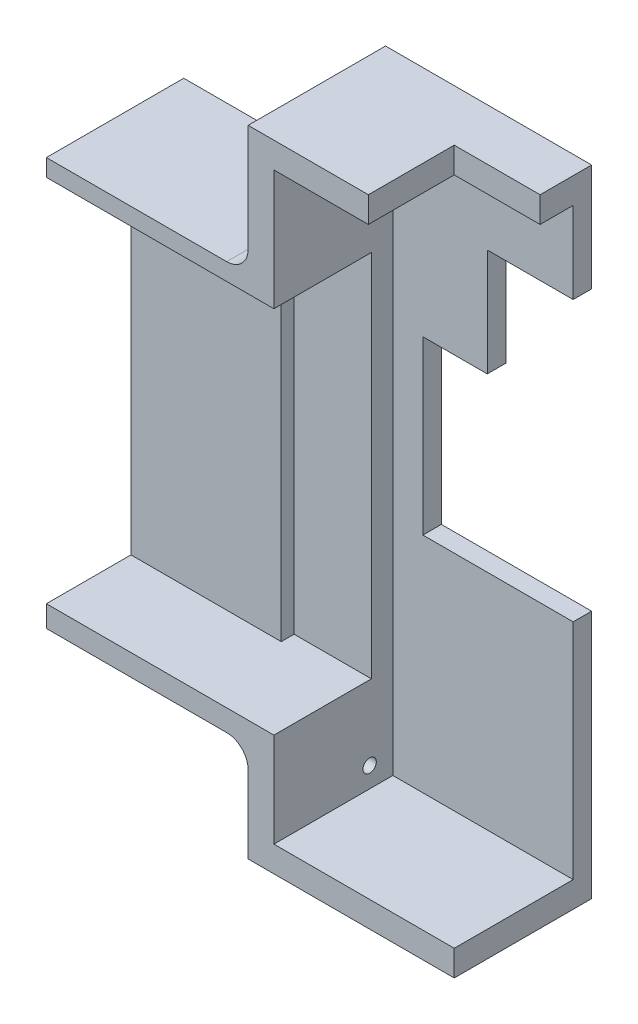
ISO-10303-21;
HEADER;
FILE_DESCRIPTION(('STEP AP214'),'2;1');
FILE_NAME('part.step','',(''),(''),'','','');
FILE_SCHEMA(('AUTOMOTIVE_DESIGN { 1 0 10303 214 1 1 1 1 }'));
ENDSEC;
DATA;
#1=APPLICATION_CONTEXT('core data for automotive mechanical design processes');
#2=APPLICATION_PROTOCOL_DEFINITION('international standard','automotive_design',2000,#1);
#3=PRODUCT_CONTEXT('',#1,'mechanical');
#4=PRODUCT('Part','Part','',(#3));
#5=PRODUCT_RELATED_PRODUCT_CATEGORY('part','',(#4));
#6=PRODUCT_DEFINITION_FORMATION('','',#4);
#7=PRODUCT_DEFINITION_CONTEXT('part definition',#1,'design');
#8=PRODUCT_DEFINITION('design','',#6,#7);
#9=PRODUCT_DEFINITION_SHAPE('','',#8);
#10=(LENGTH_UNIT() NAMED_UNIT(*) SI_UNIT(.MILLI.,.METRE.));
#11=(NAMED_UNIT(*) PLANE_ANGLE_UNIT() SI_UNIT($,.RADIAN.));
#12=(NAMED_UNIT(*) SI_UNIT($,.STERADIAN.) SOLID_ANGLE_UNIT());
#13=UNCERTAINTY_MEASURE_WITH_UNIT(LENGTH_MEASURE(1.E-05),#10,'distance_accuracy_value','');
#14=(GEOMETRIC_REPRESENTATION_CONTEXT(3) GLOBAL_UNCERTAINTY_ASSIGNED_CONTEXT((#13)) GLOBAL_UNIT_ASSIGNED_CONTEXT((#10,
#11,#12)) REPRESENTATION_CONTEXT('',''));
#15=CARTESIAN_POINT('',(0.,0.,0.));
#16=DIRECTION('',(0.,0.,1.));
#17=DIRECTION('',(1.,0.,0.));
#18=AXIS2_PLACEMENT_3D('',#15,#16,#17);
#19=CARTESIAN_POINT('',(0.,0.,0.));
#20=DIRECTION('',(0.,-1.,0.));
#21=DIRECTION('',(0.,0.,-1.));
#22=AXIS2_PLACEMENT_3D('',#19,#20,#21);
#23=PLANE('',#22);
#24=DIRECTION('',(-1.,0.,0.));
#25=VECTOR('',#24,1.);
#26=CARTESIAN_POINT('',(-65.,0.,-32.));
#27=LINE('',#26,#25);
#28=CARTESIAN_POINT('',(7.00000000000002,0.,-32.));
#29=VERTEX_POINT('',#28);
#30=CARTESIAN_POINT('',(-35.,0.,-32.));
#31=VERTEX_POINT('',#30);
#32=EDGE_CURVE('E412',#29,#31,#27,.T.);
#33=ORIENTED_EDGE('',*,*,#32,.F.);
#34=DIRECTION('',(0.,0.,1.));
#35=VECTOR('',#34,1.);
#36=CARTESIAN_POINT('',(7.00000000000002,0.,0.));
#37=LINE('',#36,#35);
#38=CARTESIAN_POINT('',(7.00000000000002,0.,0.));
#39=VERTEX_POINT('',#38);
#40=EDGE_CURVE('E448',#29,#39,#37,.T.);
#41=ORIENTED_EDGE('',*,*,#40,.T.);
#42=DIRECTION('',(-1.,0.,0.));
#43=VECTOR('',#42,1.);
#44=CARTESIAN_POINT('',(60.,0.,0.));
#45=LINE('',#44,#43);
#46=CARTESIAN_POINT('',(-35.,0.,0.));
#47=VERTEX_POINT('',#46);
#48=EDGE_CURVE('E310',#39,#47,#45,.T.);
#49=ORIENTED_EDGE('',*,*,#48,.T.);
#50=DIRECTION('',(0.,0.,1.));
#51=VECTOR('',#50,1.);
#52=CARTESIAN_POINT('',(-35.,0.,-32.));
#53=LINE('',#52,#51);
#54=EDGE_CURVE('E301',#31,#47,#53,.T.);
#55=ORIENTED_EDGE('',*,*,#54,.F.);
#56=EDGE_LOOP('',(#33,#41,#49,#55));
#57=FACE_BOUND('',#56,.T.);
#58=ADVANCED_FACE('F41',(#57),#23,.T.);
#59=CARTESIAN_POINT('',(60.,125.,-32.));
#60=DIRECTION('',(-1.,0.,0.));
#61=DIRECTION('',(0.,-1.,0.));
#62=AXIS2_PLACEMENT_3D('',#59,#60,#61);
#63=PLANE('',#62);
#64=DIRECTION('',(0.,1.,0.));
#65=VECTOR('',#64,1.);
#66=CARTESIAN_POINT('',(60.,119.,-20.));
#67=LINE('',#66,#65);
#68=CARTESIAN_POINT('',(60.,119.,-20.));
#69=VERTEX_POINT('',#68);
#70=CARTESIAN_POINT('',(60.,125.,-20.));
#71=VERTEX_POINT('',#70);
#72=EDGE_CURVE('E271',#69,#71,#67,.T.);
#73=ORIENTED_EDGE('',*,*,#72,.F.);
#74=DIRECTION('',(0.,0.,1.));
#75=VECTOR('',#74,1.);
#76=CARTESIAN_POINT('',(60.,119.,27.7));
#77=LINE('',#76,#75);
#78=CARTESIAN_POINT('',(60.,119.,-27.7));
#79=VERTEX_POINT('',#78);
#80=EDGE_CURVE('E350',#79,#69,#77,.T.);
#81=ORIENTED_EDGE('',*,*,#80,.F.);
#82=DIRECTION('',(0.,1.,0.));
#83=VECTOR('',#82,1.);
#84=CARTESIAN_POINT('',(60.,5.,-27.7));
#85=LINE('',#84,#83);
#86=CARTESIAN_POINT('',(60.,100.,-27.7));
#87=VERTEX_POINT('',#86);
#88=EDGE_CURVE('E347',#87,#79,#85,.T.);
#89=ORIENTED_EDGE('',*,*,#88,.F.);
#90=DIRECTION('',(0.,0.,1.));
#91=VECTOR('',#90,1.);
#92=CARTESIAN_POINT('',(60.,100.,-27.7));
#93=LINE('',#92,#91);
#94=CARTESIAN_POINT('',(60.,100.,-32.));
#95=VERTEX_POINT('',#94);
#96=EDGE_CURVE('E431',#95,#87,#93,.T.);
#97=ORIENTED_EDGE('',*,*,#96,.F.);
#98=DIRECTION('',(0.,-1.,0.));
#99=VECTOR('',#98,1.);
#100=CARTESIAN_POINT('',(60.,125.,-32.));
#101=LINE('',#100,#99);
#102=CARTESIAN_POINT('',(60.,125.,-32.));
#103=VERTEX_POINT('',#102);
#104=EDGE_CURVE('E341',#103,#95,#101,.T.);
#105=ORIENTED_EDGE('',*,*,#104,.F.);
#106=DIRECTION('',(0.,0.,1.));
#107=VECTOR('',#106,1.);
#108=CARTESIAN_POINT('',(60.,125.,-32.));
#109=LINE('',#108,#107);
#110=EDGE_CURVE('E344',#103,#71,#109,.T.);
#111=ORIENTED_EDGE('',*,*,#110,.T.);
#112=EDGE_LOOP('',(#73,#81,#89,#97,#105,#111));
#113=FACE_BOUND('',#112,.T.);
#114=ADVANCED_FACE('F528',(#113),#63,.F.);
#115=CARTESIAN_POINT('',(0.,125.,0.));
#116=DIRECTION('',(0.,-1.,0.));
#117=DIRECTION('',(0.,0.,-1.));
#118=AXIS2_PLACEMENT_3D('',#115,#116,#117);
#119=PLANE('',#118);
#120=DIRECTION('',(-1.,0.,0.));
#121=VECTOR('',#120,1.);
#122=CARTESIAN_POINT('',(50.,125.,-20.));
#123=LINE('',#122,#121);
#124=CARTESIAN_POINT('',(40.,125.,-20.));
#125=VERTEX_POINT('',#124);
#126=EDGE_CURVE('E357',#71,#125,#123,.T.);
#127=ORIENTED_EDGE('',*,*,#126,.F.);
#128=ORIENTED_EDGE('',*,*,#110,.F.);
#129=DIRECTION('',(-1.,0.,0.));
#130=VECTOR('',#129,1.);
#131=CARTESIAN_POINT('',(-65.,125.,-32.));
#132=LINE('',#131,#130);
#133=CARTESIAN_POINT('',(12.,125.,-32.));
#134=VERTEX_POINT('',#133);
#135=EDGE_CURVE('E413',#103,#134,#132,.T.);
#136=ORIENTED_EDGE('',*,*,#135,.T.);
#137=DIRECTION('',(0.,0.,-1.));
#138=VECTOR('',#137,1.);
#139=CARTESIAN_POINT('',(12.,125.,32.));
#140=LINE('',#139,#138);
#141=CARTESIAN_POINT('',(12.,125.,0.));
#142=VERTEX_POINT('',#141);
#143=EDGE_CURVE('E333',#142,#134,#140,.T.);
#144=ORIENTED_EDGE('',*,*,#143,.F.);
#145=DIRECTION('',(1.,0.,0.));
#146=VECTOR('',#145,1.);
#147=CARTESIAN_POINT('',(0.,125.,0.));
#148=LINE('',#147,#146);
#149=CARTESIAN_POINT('',(40.,125.,0.));
#150=VERTEX_POINT('',#149);
#151=EDGE_CURVE('E315',#142,#150,#148,.T.);
#152=ORIENTED_EDGE('',*,*,#151,.T.);
#153=DIRECTION('',(0.,0.,1.));
#154=VECTOR('',#153,1.);
#155=CARTESIAN_POINT('',(40.,125.,-20.));
#156=LINE('',#155,#154);
#157=EDGE_CURVE('E360',#125,#150,#156,.T.);
#158=ORIENTED_EDGE('',*,*,#157,.F.);
#159=EDGE_LOOP('',(#127,#128,#136,#144,#152,#158));
#160=FACE_BOUND('',#159,.T.);
#161=ADVANCED_FACE('F482',(#160),#119,.F.);
#162=CARTESIAN_POINT('',(18.,119.,27.7));
#163=DIRECTION('',(0.,1.,0.));
#164=DIRECTION('',(0.,0.,1.));
#165=AXIS2_PLACEMENT_3D('',#162,#163,#164);
#166=PLANE('',#165);
#167=ORIENTED_EDGE('',*,*,#80,.T.);
#168=DIRECTION('',(-1.,0.,0.));
#169=VECTOR('',#168,1.);
#170=CARTESIAN_POINT('',(18.,119.,-20.));
#171=LINE('',#170,#169);
#172=CARTESIAN_POINT('',(40.,119.,-20.));
#173=VERTEX_POINT('',#172);
#174=EDGE_CURVE('E425',#69,#173,#171,.T.);
#175=ORIENTED_EDGE('',*,*,#174,.T.);
#176=DIRECTION('',(0.,0.,1.));
#177=VECTOR('',#176,1.);
#178=CARTESIAN_POINT('',(40.,119.,27.7));
#179=LINE('',#178,#177);
#180=CARTESIAN_POINT('',(40.,119.,0.));
#181=VERTEX_POINT('',#180);
#182=EDGE_CURVE('E428',#173,#181,#179,.T.);
#183=ORIENTED_EDGE('',*,*,#182,.T.);
#184=DIRECTION('',(-1.,0.,0.));
#185=VECTOR('',#184,1.);
#186=CARTESIAN_POINT('',(18.,119.,0.));
#187=LINE('',#186,#185);
#188=CARTESIAN_POINT('',(18.,119.,0.));
#189=VERTEX_POINT('',#188);
#190=EDGE_CURVE('E321',#181,#189,#187,.T.);
#191=ORIENTED_EDGE('',*,*,#190,.T.);
#192=DIRECTION('',(0.,0.,1.));
#193=VECTOR('',#192,1.);
#194=CARTESIAN_POINT('',(18.,119.,27.7));
#195=LINE('',#194,#193);
#196=CARTESIAN_POINT('',(18.,119.,-27.7));
#197=VERTEX_POINT('',#196);
#198=EDGE_CURVE('E406',#197,#189,#195,.T.);
#199=ORIENTED_EDGE('',*,*,#198,.F.);
#200=DIRECTION('',(1.,0.,0.));
#201=VECTOR('',#200,1.);
#202=CARTESIAN_POINT('',(18.,119.,-27.7));
#203=LINE('',#202,#201);
#204=EDGE_CURVE('E409',#197,#79,#203,.T.);
#205=ORIENTED_EDGE('',*,*,#204,.T.);
#206=EDGE_LOOP('',(#167,#175,#183,#191,#199,#205));
#207=FACE_BOUND('',#206,.T.);
#208=ADVANCED_FACE('F599',(#207),#166,.F.);
#209=CARTESIAN_POINT('',(18.,5.,27.7));
#210=DIRECTION('',(0.,-1.,0.));
#211=DIRECTION('',(0.,0.,-1.));
#212=AXIS2_PLACEMENT_3D('',#209,#210,#211);
#213=PLANE('',#212);
#214=DIRECTION('',(1.,0.,0.));
#215=VECTOR('',#214,1.);
#216=CARTESIAN_POINT('',(18.,5.,0.));
#217=LINE('',#216,#215);
#218=CARTESIAN_POINT('',(-35.,5.,0.));
#219=VERTEX_POINT('',#218);
#220=CARTESIAN_POINT('',(18.,5.,0.));
#221=VERTEX_POINT('',#220);
#222=EDGE_CURVE('E330',#219,#221,#217,.T.);
#223=ORIENTED_EDGE('',*,*,#222,.T.);
#224=DIRECTION('',(0.,0.,1.));
#225=VECTOR('',#224,1.);
#226=CARTESIAN_POINT('',(18.,5.,-27.7));
#227=LINE('',#226,#225);
#228=CARTESIAN_POINT('',(18.,5.,-22.7));
#229=VERTEX_POINT('',#228);
#230=EDGE_CURVE('E232',#229,#221,#227,.T.);
#231=ORIENTED_EDGE('',*,*,#230,.F.);
#232=DIRECTION('',(1.,0.,0.));
#233=VECTOR('',#232,1.);
#234=CARTESIAN_POINT('',(-60.,5.,-22.7));
#235=LINE('',#234,#233);
#236=CARTESIAN_POINT('',(0.,5.,-22.7));
#237=VERTEX_POINT('',#236);
#238=EDGE_CURVE('E398',#237,#229,#235,.T.);
#239=ORIENTED_EDGE('',*,*,#238,.F.);
#240=DIRECTION('',(0.,0.,-1.));
#241=VECTOR('',#240,1.);
#242=CARTESIAN_POINT('',(0.,5.00000000000001,-19.7));
#243=LINE('',#242,#241);
#244=CARTESIAN_POINT('',(0.,5.,-19.7));
#245=VERTEX_POINT('',#244);
#246=EDGE_CURVE('E291',#245,#237,#243,.T.);
#247=ORIENTED_EDGE('',*,*,#246,.F.);
#248=DIRECTION('',(1.,0.,0.));
#249=VECTOR('',#248,1.);
#250=CARTESIAN_POINT('',(-35.,5.,-19.7));
#251=LINE('',#250,#249);
#252=CARTESIAN_POINT('',(-35.,5.,-19.7));
#253=VERTEX_POINT('',#252);
#254=EDGE_CURVE('E278',#253,#245,#251,.T.);
#255=ORIENTED_EDGE('',*,*,#254,.F.);
#256=DIRECTION('',(0.,0.,1.));
#257=VECTOR('',#256,1.);
#258=CARTESIAN_POINT('',(-35.,5.,27.7));
#259=LINE('',#258,#257);
#260=EDGE_CURVE('E308',#253,#219,#259,.T.);
#261=ORIENTED_EDGE('',*,*,#260,.T.);
#262=EDGE_LOOP('',(#223,#231,#239,#247,#255,#261));
#263=FACE_BOUND('',#262,.T.);
#264=ADVANCED_FACE('F591',(#263),#213,.F.);
#265=CARTESIAN_POINT('',(-60.,91.,22.7));
#266=DIRECTION('',(0.,1.,0.));
#267=DIRECTION('',(0.,0.,1.));
#268=AXIS2_PLACEMENT_3D('',#265,#266,#267);
#269=PLANE('',#268);
#270=DIRECTION('',(0.,0.,-1.));
#271=VECTOR('',#270,1.);
#272=CARTESIAN_POINT('',(0.,91.,-19.7));
#273=LINE('',#272,#271);
#274=CARTESIAN_POINT('',(0.,91.,-19.7));
#275=VERTEX_POINT('',#274);
#276=CARTESIAN_POINT('',(0.,91.,-22.7));
#277=VERTEX_POINT('',#276);
#278=EDGE_CURVE('E287',#275,#277,#273,.T.);
#279=ORIENTED_EDGE('',*,*,#278,.T.);
#280=DIRECTION('',(1.,0.,0.));
#281=VECTOR('',#280,1.);
#282=CARTESIAN_POINT('',(-60.,91.,-22.7));
#283=LINE('',#282,#281);
#284=CARTESIAN_POINT('',(18.,91.,-22.7));
#285=VERTEX_POINT('',#284);
#286=EDGE_CURVE('E399',#277,#285,#283,.T.);
#287=ORIENTED_EDGE('',*,*,#286,.T.);
#288=DIRECTION('',(0.,0.,1.));
#289=VECTOR('',#288,1.);
#290=CARTESIAN_POINT('',(18.,91.,22.7));
#291=LINE('',#290,#289);
#292=CARTESIAN_POINT('',(18.,91.,0.));
#293=VERTEX_POINT('',#292);
#294=EDGE_CURVE('E395',#285,#293,#291,.T.);
#295=ORIENTED_EDGE('',*,*,#294,.T.);
#296=DIRECTION('',(-1.,0.,0.));
#297=VECTOR('',#296,1.);
#298=CARTESIAN_POINT('',(-60.,91.,0.));
#299=LINE('',#298,#297);
#300=CARTESIAN_POINT('',(-35.,91.,0.));
#301=VERTEX_POINT('',#300);
#302=EDGE_CURVE('E327',#293,#301,#299,.T.);
#303=ORIENTED_EDGE('',*,*,#302,.T.);
#304=DIRECTION('',(0.,0.,-1.));
#305=VECTOR('',#304,1.);
#306=CARTESIAN_POINT('',(-35.,91.,22.7));
#307=LINE('',#306,#305);
#308=CARTESIAN_POINT('',(-35.,91.,-19.7));
#309=VERTEX_POINT('',#308);
#310=EDGE_CURVE('E304',#301,#309,#307,.T.);
#311=ORIENTED_EDGE('',*,*,#310,.T.);
#312=DIRECTION('',(-1.,0.,0.));
#313=VECTOR('',#312,1.);
#314=CARTESIAN_POINT('',(-35.,91.,-19.7));
#315=LINE('',#314,#313);
#316=EDGE_CURVE('E284',#275,#309,#315,.T.);
#317=ORIENTED_EDGE('',*,*,#316,.F.);
#318=EDGE_LOOP('',(#279,#287,#295,#303,#311,#317));
#319=FACE_BOUND('',#318,.T.);
#320=ADVANCED_FACE('F588',(#319),#269,.F.);
#321=CARTESIAN_POINT('',(-60.,91.,-22.7));
#322=DIRECTION('',(0.,0.,-1.));
#323=DIRECTION('',(0.,1.,0.));
#324=AXIS2_PLACEMENT_3D('',#321,#322,#323);
#325=PLANE('',#324);
#326=DIRECTION('',(0.,1.,0.));
#327=VECTOR('',#326,1.);
#328=CARTESIAN_POINT('',(0.,91.,-22.7));
#329=LINE('',#328,#327);
#330=EDGE_CURVE('E274',#237,#277,#329,.T.);
#331=ORIENTED_EDGE('',*,*,#330,.F.);
#332=ORIENTED_EDGE('',*,*,#238,.T.);
#333=DIRECTION('',(0.,1.,0.));
#334=VECTOR('',#333,1.);
#335=CARTESIAN_POINT('',(18.,91.,-22.7));
#336=LINE('',#335,#334);
#337=EDGE_CURVE('E392',#229,#285,#336,.T.);
#338=ORIENTED_EDGE('',*,*,#337,.T.);
#339=ORIENTED_EDGE('',*,*,#286,.F.);
#340=EDGE_LOOP('',(#331,#332,#338,#339));
#341=FACE_BOUND('',#340,.T.);
#342=ADVANCED_FACE('F563',(#341),#325,.F.);
#343=CARTESIAN_POINT('',(60.,0.,0.));
#344=DIRECTION('',(0.,0.,-1.));
#345=DIRECTION('',(0.,1.,0.));
#346=AXIS2_PLACEMENT_3D('',#343,#344,#345);
#347=PLANE('',#346);
#348=DIRECTION('',(1.,0.,0.));
#349=VECTOR('',#348,1.);
#350=CARTESIAN_POINT('',(-65.,95.,0.));
#351=LINE('',#350,#349);
#352=CARTESIAN_POINT('',(-35.,95.,0.));
#353=VERTEX_POINT('',#352);
#354=CARTESIAN_POINT('',(7.00000000000002,95.,0.));
#355=VERTEX_POINT('',#354);
#356=EDGE_CURVE('E312',#353,#355,#351,.T.);
#357=ORIENTED_EDGE('',*,*,#356,.F.);
#358=DIRECTION('',(0.,-1.,0.));
#359=VECTOR('',#358,1.);
#360=CARTESIAN_POINT('',(-35.,0.,0.));
#361=LINE('',#360,#359);
#362=EDGE_CURVE('E436',#353,#301,#361,.T.);
#363=ORIENTED_EDGE('',*,*,#362,.T.);
#364=ORIENTED_EDGE('',*,*,#302,.F.);
#365=DIRECTION('',(0.,-1.,0.));
#366=VECTOR('',#365,1.);
#367=CARTESIAN_POINT('',(18.,0.,0.));
#368=LINE('',#367,#366);
#369=EDGE_CURVE('E324',#189,#293,#368,.T.);
#370=ORIENTED_EDGE('',*,*,#369,.F.);
#371=ORIENTED_EDGE('',*,*,#190,.F.);
#372=DIRECTION('',(0.,-1.,0.));
#373=VECTOR('',#372,1.);
#374=CARTESIAN_POINT('',(40.,100.,0.));
#375=LINE('',#374,#373);
#376=EDGE_CURVE('E318',#150,#181,#375,.T.);
#377=ORIENTED_EDGE('',*,*,#376,.F.);
#378=ORIENTED_EDGE('',*,*,#151,.F.);
#379=DIRECTION('',(0.,1.,0.));
#380=VECTOR('',#379,1.);
#381=CARTESIAN_POINT('',(12.,95.,0.));
#382=LINE('',#381,#380);
#383=CARTESIAN_POINT('',(12.,100.,0.));
#384=VERTEX_POINT('',#383);
#385=EDGE_CURVE('E434',#384,#142,#382,.T.);
#386=ORIENTED_EDGE('',*,*,#385,.F.);
#387=CARTESIAN_POINT('',(7.00000000000002,100.,0.));
#388=DIRECTION('',(0.,0.,-1.));
#389=DIRECTION('',(0.,1.,0.));
#390=AXIS2_PLACEMENT_3D('',#387,#388,#389);
#391=CIRCLE('',#390,5.);
#392=EDGE_CURVE('E446',#384,#355,#391,.T.);
#393=ORIENTED_EDGE('',*,*,#392,.T.);
#394=EDGE_LOOP('',(#357,#363,#364,#370,#371,#377,#378,#386,#393));
#395=FACE_BOUND('',#394,.T.);
#396=ADVANCED_FACE('F560',(#395),#347,.F.);
#397=CARTESIAN_POINT('',(18.,0.,0.));
#398=DIRECTION('',(-1.,0.,0.));
#399=DIRECTION('',(0.,0.,1.));
#400=AXIS2_PLACEMENT_3D('',#397,#398,#399);
#401=PLANE('',#400);
#402=CARTESIAN_POINT('',(18.,113.3,-22.2999999999998));
#403=DIRECTION('',(-1.,0.,0.));
#404=DIRECTION('',(0.,0.,1.));
#405=AXIS2_PLACEMENT_3D('',#402,#403,#404);
#406=CIRCLE('',#405,1.54999999999995);
#407=CARTESIAN_POINT('',(18.,113.3,-20.7499999999998));
#408=VERTEX_POINT('',#407);
#409=EDGE_CURVE('E239',#408,#408,#406,.T.);
#410=ORIENTED_EDGE('',*,*,#409,.T.);
#411=EDGE_LOOP('',(#410));
#412=FACE_BOUND('',#411,.T.);
#413=CARTESIAN_POINT('',(18.,-12.2999999999998,-22.2999999999998));
#414=DIRECTION('',(-1.,0.,0.));
#415=DIRECTION('',(0.,0.,1.));
#416=AXIS2_PLACEMENT_3D('',#413,#414,#415);
#417=CIRCLE('',#416,1.55000000000001);
#418=CARTESIAN_POINT('',(18.,-12.2999999999998,-20.7499999999998));
#419=VERTEX_POINT('',#418);
#420=EDGE_CURVE('E856',#419,#419,#417,.T.);
#421=ORIENTED_EDGE('',*,*,#420,.T.);
#422=EDGE_LOOP('',(#421));
#423=FACE_BOUND('',#422,.T.);
#424=ORIENTED_EDGE('',*,*,#198,.T.);
#425=ORIENTED_EDGE('',*,*,#369,.T.);
#426=ORIENTED_EDGE('',*,*,#294,.F.);
#427=ORIENTED_EDGE('',*,*,#337,.F.);
#428=ORIENTED_EDGE('',*,*,#230,.T.);
#429=DIRECTION('',(0.,1.,0.));
#430=VECTOR('',#429,1.);
#431=CARTESIAN_POINT('',(18.,0.,0.));
#432=LINE('',#431,#430);
#433=CARTESIAN_POINT('',(18.,-17.,0.));
#434=VERTEX_POINT('',#433);
#435=EDGE_CURVE('E268',#434,#221,#432,.T.);
#436=ORIENTED_EDGE('',*,*,#435,.F.);
#437=DIRECTION('',(0.,0.,1.));
#438=VECTOR('',#437,1.);
#439=CARTESIAN_POINT('',(18.,-17.,-80.9259335286851));
#440=LINE('',#439,#438);
#441=CARTESIAN_POINT('',(18.,-17.,-27.7));
#442=VERTEX_POINT('',#441);
#443=EDGE_CURVE('E233',#442,#434,#440,.T.);
#444=ORIENTED_EDGE('',*,*,#443,.F.);
#445=DIRECTION('',(0.,1.,0.));
#446=VECTOR('',#445,1.);
#447=CARTESIAN_POINT('',(18.,5.,-27.7));
#448=LINE('',#447,#446);
#449=EDGE_CURVE('E401',#442,#197,#448,.T.);
#450=ORIENTED_EDGE('',*,*,#449,.T.);
#451=EDGE_LOOP('',(#424,#425,#426,#427,#428,#436,#444,#450));
#452=FACE_BOUND('',#451,.T.);
#453=ADVANCED_FACE('F538',(#412,#423,#452),#401,.F.);
#454=CARTESIAN_POINT('',(-65.,125.,-32.));
#455=DIRECTION('',(0.,0.,1.));
#456=DIRECTION('',(1.,0.,0.));
#457=AXIS2_PLACEMENT_3D('',#454,#455,#456);
#458=PLANE('',#457);
#459=CARTESIAN_POINT('',(60.,35.,-32.));
#460=VERTEX_POINT('',#459);
#461=CARTESIAN_POINT('',(60.,-23.,-32.));
#462=VERTEX_POINT('',#461);
#463=EDGE_CURVE('E243',#460,#462,#101,.T.);
#464=ORIENTED_EDGE('',*,*,#463,.T.);
#465=DIRECTION('',(1.,0.,0.));
#466=VECTOR('',#465,1.);
#467=CARTESIAN_POINT('',(60.,-23.,-32.));
#468=LINE('',#467,#466);
#469=CARTESIAN_POINT('',(12.,-23.,-32.));
#470=VERTEX_POINT('',#469);
#471=EDGE_CURVE('E229',#470,#462,#468,.T.);
#472=ORIENTED_EDGE('',*,*,#471,.F.);
#473=DIRECTION('',(0.,1.,0.));
#474=VECTOR('',#473,1.);
#475=CARTESIAN_POINT('',(12.,-71.1922192890097,-32.));
#476=LINE('',#475,#474);
#477=CARTESIAN_POINT('',(12.,-5.,-32.));
#478=VERTEX_POINT('',#477);
#479=EDGE_CURVE('E235',#470,#478,#476,.T.);
#480=ORIENTED_EDGE('',*,*,#479,.T.);
#481=CARTESIAN_POINT('',(7.00000000000002,-5.,-32.));
#482=DIRECTION('',(0.,0.,1.));
#483=DIRECTION('',(1.,0.,0.));
#484=AXIS2_PLACEMENT_3D('',#481,#482,#483);
#485=CIRCLE('',#484,5.);
#486=EDGE_CURVE('E11',#478,#29,#485,.T.);
#487=ORIENTED_EDGE('',*,*,#486,.T.);
#488=ORIENTED_EDGE('',*,*,#32,.T.);
#489=DIRECTION('',(0.,1.,0.));
#490=VECTOR('',#489,1.);
#491=CARTESIAN_POINT('',(-35.,95.,-32.));
#492=LINE('',#491,#490);
#493=CARTESIAN_POINT('',(-35.,95.,-32.));
#494=VERTEX_POINT('',#493);
#495=EDGE_CURVE('E295',#31,#494,#492,.T.);
#496=ORIENTED_EDGE('',*,*,#495,.T.);
#497=DIRECTION('',(1.,0.,0.));
#498=VECTOR('',#497,1.);
#499=CARTESIAN_POINT('',(-65.,95.,-32.));
#500=LINE('',#499,#498);
#501=CARTESIAN_POINT('',(7.00000000000002,95.,-32.));
#502=VERTEX_POINT('',#501);
#503=EDGE_CURVE('E338',#494,#502,#500,.T.);
#504=ORIENTED_EDGE('',*,*,#503,.T.);
#505=CARTESIAN_POINT('',(7.00000000000002,100.,-32.));
#506=DIRECTION('',(0.,0.,1.));
#507=DIRECTION('',(1.,0.,0.));
#508=AXIS2_PLACEMENT_3D('',#505,#506,#507);
#509=CIRCLE('',#508,5.);
#510=CARTESIAN_POINT('',(12.,100.,-32.));
#511=VERTEX_POINT('',#510);
#512=EDGE_CURVE('E444',#502,#511,#509,.T.);
#513=ORIENTED_EDGE('',*,*,#512,.T.);
#514=DIRECTION('',(0.,1.,0.));
#515=VECTOR('',#514,1.);
#516=CARTESIAN_POINT('',(12.,95.,-32.));
#517=LINE('',#516,#515);
#518=EDGE_CURVE('E336',#511,#134,#517,.T.);
#519=ORIENTED_EDGE('',*,*,#518,.T.);
#520=ORIENTED_EDGE('',*,*,#135,.F.);
#521=ORIENTED_EDGE('',*,*,#104,.T.);
#522=DIRECTION('',(1.,0.,0.));
#523=VECTOR('',#522,1.);
#524=CARTESIAN_POINT('',(40.,100.,-32.));
#525=LINE('',#524,#523);
#526=CARTESIAN_POINT('',(40.,100.,-32.));
#527=VERTEX_POINT('',#526);
#528=EDGE_CURVE('E374',#527,#95,#525,.T.);
#529=ORIENTED_EDGE('',*,*,#528,.F.);
#530=DIRECTION('',(0.,1.,0.));
#531=VECTOR('',#530,1.);
#532=CARTESIAN_POINT('',(40.,75.,-32.));
#533=LINE('',#532,#531);
#534=CARTESIAN_POINT('',(40.,75.,-32.));
#535=VERTEX_POINT('',#534);
#536=EDGE_CURVE('E369',#535,#527,#533,.T.);
#537=ORIENTED_EDGE('',*,*,#536,.F.);
#538=DIRECTION('',(-1.,0.,0.));
#539=VECTOR('',#538,1.);
#540=CARTESIAN_POINT('',(-65.,75.,-32.));
#541=LINE('',#540,#539);
#542=CARTESIAN_POINT('',(25.,75.,-32.));
#543=VERTEX_POINT('',#542);
#544=EDGE_CURVE('E390',#535,#543,#541,.T.);
#545=ORIENTED_EDGE('',*,*,#544,.T.);
#546=DIRECTION('',(0.,1.,0.));
#547=VECTOR('',#546,1.);
#548=CARTESIAN_POINT('',(25.,125.,-32.));
#549=LINE('',#548,#547);
#550=CARTESIAN_POINT('',(25.,35.,-32.));
#551=VERTEX_POINT('',#550);
#552=EDGE_CURVE('E385',#551,#543,#549,.T.);
#553=ORIENTED_EDGE('',*,*,#552,.F.);
#554=DIRECTION('',(1.,0.,0.));
#555=VECTOR('',#554,1.);
#556=CARTESIAN_POINT('',(-65.,35.,-32.));
#557=LINE('',#556,#555);
#558=EDGE_CURVE('E388',#551,#460,#557,.T.);
#559=ORIENTED_EDGE('',*,*,#558,.T.);
#560=EDGE_LOOP('',(#464,#472,#480,#487,#488,#496,#504,#513,#519,#520,#521,#529,#537,#545,#553,#559));
#561=FACE_BOUND('',#560,.T.);
#562=ADVANCED_FACE('F241',(#561),#458,.F.);
#563=CARTESIAN_POINT('',(18.,5.,-27.7));
#564=DIRECTION('',(0.,0.,-1.));
#565=DIRECTION('',(-1.,0.,0.));
#566=AXIS2_PLACEMENT_3D('',#563,#564,#565);
#567=PLANE('',#566);
#568=ORIENTED_EDGE('',*,*,#449,.F.);
#569=DIRECTION('',(-1.,0.,0.));
#570=VECTOR('',#569,1.);
#571=CARTESIAN_POINT('',(18.,-17.,-27.7));
#572=LINE('',#571,#570);
#573=CARTESIAN_POINT('',(60.,-17.,-27.7));
#574=VERTEX_POINT('',#573);
#575=EDGE_CURVE('E259',#574,#442,#572,.T.);
#576=ORIENTED_EDGE('',*,*,#575,.F.);
#577=CARTESIAN_POINT('',(60.,35.,-27.7));
#578=VERTEX_POINT('',#577);
#579=EDGE_CURVE('E351',#574,#578,#85,.T.);
#580=ORIENTED_EDGE('',*,*,#579,.T.);
#581=DIRECTION('',(-1.,0.,0.));
#582=VECTOR('',#581,1.);
#583=CARTESIAN_POINT('',(18.,35.,-27.7));
#584=LINE('',#583,#582);
#585=CARTESIAN_POINT('',(25.,35.,-27.7));
#586=VERTEX_POINT('',#585);
#587=EDGE_CURVE('E420',#578,#586,#584,.T.);
#588=ORIENTED_EDGE('',*,*,#587,.T.);
#589=DIRECTION('',(0.,-1.,0.));
#590=VECTOR('',#589,1.);
#591=CARTESIAN_POINT('',(25.,5.,-27.7));
#592=LINE('',#591,#590);
#593=CARTESIAN_POINT('',(25.,75.,-27.7));
#594=VERTEX_POINT('',#593);
#595=EDGE_CURVE('E416',#594,#586,#592,.T.);
#596=ORIENTED_EDGE('',*,*,#595,.F.);
#597=DIRECTION('',(1.,0.,0.));
#598=VECTOR('',#597,1.);
#599=CARTESIAN_POINT('',(18.,75.,-27.7));
#600=LINE('',#599,#598);
#601=CARTESIAN_POINT('',(40.,75.,-27.7));
#602=VERTEX_POINT('',#601);
#603=EDGE_CURVE('E422',#594,#602,#600,.T.);
#604=ORIENTED_EDGE('',*,*,#603,.T.);
#605=DIRECTION('',(0.,-1.,0.));
#606=VECTOR('',#605,1.);
#607=CARTESIAN_POINT('',(40.,75.,-27.7));
#608=LINE('',#607,#606);
#609=CARTESIAN_POINT('',(40.,100.,-27.7));
#610=VERTEX_POINT('',#609);
#611=EDGE_CURVE('E365',#610,#602,#608,.T.);
#612=ORIENTED_EDGE('',*,*,#611,.F.);
#613=DIRECTION('',(1.,0.,0.));
#614=VECTOR('',#613,1.);
#615=CARTESIAN_POINT('',(40.,100.,-27.7));
#616=LINE('',#615,#614);
#617=EDGE_CURVE('E375',#610,#87,#616,.T.);
#618=ORIENTED_EDGE('',*,*,#617,.T.);
#619=ORIENTED_EDGE('',*,*,#88,.T.);
#620=ORIENTED_EDGE('',*,*,#204,.F.);
#621=EDGE_LOOP('',(#568,#576,#580,#588,#596,#604,#612,#618,#619,#620));
#622=FACE_BOUND('',#621,.T.);
#623=ADVANCED_FACE('F494',(#622),#567,.F.);
#624=CARTESIAN_POINT('',(25.,75.,-14.5498651525304));
#625=DIRECTION('',(0.,1.,0.));
#626=DIRECTION('',(0.,0.,1.));
#627=AXIS2_PLACEMENT_3D('',#624,#625,#626);
#628=PLANE('',#627);
#629=ORIENTED_EDGE('',*,*,#544,.F.);
#630=DIRECTION('',(0.,0.,-1.));
#631=VECTOR('',#630,1.);
#632=CARTESIAN_POINT('',(40.,75.,-27.7));
#633=LINE('',#632,#631);
#634=EDGE_CURVE('E367',#602,#535,#633,.T.);
#635=ORIENTED_EDGE('',*,*,#634,.F.);
#636=ORIENTED_EDGE('',*,*,#603,.F.);
#637=DIRECTION('',(0.,0.,1.));
#638=VECTOR('',#637,1.);
#639=CARTESIAN_POINT('',(25.,75.,-14.5498651525304));
#640=LINE('',#639,#638);
#641=EDGE_CURVE('E383',#543,#594,#640,.T.);
#642=ORIENTED_EDGE('',*,*,#641,.F.);
#643=EDGE_LOOP('',(#629,#635,#636,#642));
#644=FACE_BOUND('',#643,.T.);
#645=ADVANCED_FACE('F500',(#644),#628,.F.);
#646=CARTESIAN_POINT('',(25.,35.,-14.5498651525304));
#647=DIRECTION('',(0.,-1.,0.));
#648=DIRECTION('',(0.,0.,-1.));
#649=AXIS2_PLACEMENT_3D('',#646,#647,#648);
#650=PLANE('',#649);
#651=ORIENTED_EDGE('',*,*,#587,.F.);
#652=DIRECTION('',(0.,0.,-1.));
#653=VECTOR('',#652,1.);
#654=CARTESIAN_POINT('',(60.,35.,-14.5498651525304));
#655=LINE('',#654,#653);
#656=EDGE_CURVE('E354',#578,#460,#655,.T.);
#657=ORIENTED_EDGE('',*,*,#656,.T.);
#658=ORIENTED_EDGE('',*,*,#558,.F.);
#659=DIRECTION('',(0.,0.,-1.));
#660=VECTOR('',#659,1.);
#661=CARTESIAN_POINT('',(25.,35.,-14.5498651525304));
#662=LINE('',#661,#660);
#663=EDGE_CURVE('E378',#586,#551,#662,.T.);
#664=ORIENTED_EDGE('',*,*,#663,.F.);
#665=EDGE_LOOP('',(#651,#657,#658,#664));
#666=FACE_BOUND('',#665,.T.);
#667=ADVANCED_FACE('F507',(#666),#650,.F.);
#668=CARTESIAN_POINT('',(25.,0.,0.));
#669=DIRECTION('',(1.,0.,0.));
#670=DIRECTION('',(0.,0.,-1.));
#671=AXIS2_PLACEMENT_3D('',#668,#669,#670);
#672=PLANE('',#671);
#673=ORIENTED_EDGE('',*,*,#552,.T.);
#674=ORIENTED_EDGE('',*,*,#641,.T.);
#675=ORIENTED_EDGE('',*,*,#595,.T.);
#676=ORIENTED_EDGE('',*,*,#663,.T.);
#677=EDGE_LOOP('',(#673,#674,#675,#676));
#678=FACE_BOUND('',#677,.T.);
#679=ADVANCED_FACE('F503',(#678),#672,.T.);
#680=CARTESIAN_POINT('',(40.,100.,-27.7));
#681=DIRECTION('',(0.,1.,0.));
#682=DIRECTION('',(0.,0.,1.));
#683=AXIS2_PLACEMENT_3D('',#680,#681,#682);
#684=PLANE('',#683);
#685=ORIENTED_EDGE('',*,*,#528,.T.);
#686=ORIENTED_EDGE('',*,*,#96,.T.);
#687=ORIENTED_EDGE('',*,*,#617,.F.);
#688=DIRECTION('',(0.,0.,1.));
#689=VECTOR('',#688,1.);
#690=CARTESIAN_POINT('',(40.,100.,-27.7));
#691=LINE('',#690,#689);
#692=EDGE_CURVE('E371',#527,#610,#691,.T.);
#693=ORIENTED_EDGE('',*,*,#692,.F.);
#694=EDGE_LOOP('',(#685,#686,#687,#693));
#695=FACE_BOUND('',#694,.T.);
#696=ADVANCED_FACE('F488',(#695),#684,.F.);
#697=CARTESIAN_POINT('',(40.,0.,0.));
#698=DIRECTION('',(-1.,0.,0.));
#699=DIRECTION('',(0.,0.,1.));
#700=AXIS2_PLACEMENT_3D('',#697,#698,#699);
#701=PLANE('',#700);
#702=ORIENTED_EDGE('',*,*,#611,.T.);
#703=ORIENTED_EDGE('',*,*,#634,.T.);
#704=ORIENTED_EDGE('',*,*,#536,.T.);
#705=ORIENTED_EDGE('',*,*,#692,.T.);
#706=EDGE_LOOP('',(#702,#703,#704,#705));
#707=FACE_BOUND('',#706,.T.);
#708=ADVANCED_FACE('F491',(#707),#701,.F.);
#709=CARTESIAN_POINT('',(40.,100.,-20.));
#710=DIRECTION('',(-1.,0.,0.));
#711=DIRECTION('',(0.,0.,1.));
#712=AXIS2_PLACEMENT_3D('',#709,#710,#711);
#713=PLANE('',#712);
#714=ORIENTED_EDGE('',*,*,#157,.T.);
#715=ORIENTED_EDGE('',*,*,#376,.T.);
#716=ORIENTED_EDGE('',*,*,#182,.F.);
#717=DIRECTION('',(0.,1.,0.));
#718=VECTOR('',#717,1.);
#719=CARTESIAN_POINT('',(40.,100.,-20.));
#720=LINE('',#719,#718);
#721=EDGE_CURVE('E363',#173,#125,#720,.T.);
#722=ORIENTED_EDGE('',*,*,#721,.T.);
#723=EDGE_LOOP('',(#714,#715,#716,#722));
#724=FACE_BOUND('',#723,.T.);
#725=ADVANCED_FACE('F571',(#724),#713,.F.);
#726=CARTESIAN_POINT('',(50.,100.,-20.));
#727=DIRECTION('',(0.,0.,-1.));
#728=DIRECTION('',(-1.,0.,0.));
#729=AXIS2_PLACEMENT_3D('',#726,#727,#728);
#730=PLANE('',#729);
#731=ORIENTED_EDGE('',*,*,#174,.F.);
#732=ORIENTED_EDGE('',*,*,#72,.T.);
#733=ORIENTED_EDGE('',*,*,#126,.T.);
#734=ORIENTED_EDGE('',*,*,#721,.F.);
#735=EDGE_LOOP('',(#731,#732,#733,#734));
#736=FACE_BOUND('',#735,.T.);
#737=ADVANCED_FACE('F570',(#736),#730,.F.);
#738=ORIENTED_EDGE('',*,*,#579,.F.);
#739=DIRECTION('',(0.,0.,1.));
#740=VECTOR('',#739,1.);
#741=CARTESIAN_POINT('',(60.,-17.,-80.9259335286851));
#742=LINE('',#741,#740);
#743=CARTESIAN_POINT('',(60.,-17.,0.));
#744=VERTEX_POINT('',#743);
#745=EDGE_CURVE('E262',#574,#744,#742,.T.);
#746=ORIENTED_EDGE('',*,*,#745,.T.);
#747=DIRECTION('',(0.,1.,0.));
#748=VECTOR('',#747,1.);
#749=CARTESIAN_POINT('',(60.,-17.,0.));
#750=LINE('',#749,#748);
#751=CARTESIAN_POINT('',(60.,-23.,0.));
#752=VERTEX_POINT('',#751);
#753=EDGE_CURVE('E255',#752,#744,#750,.T.);
#754=ORIENTED_EDGE('',*,*,#753,.F.);
#755=DIRECTION('',(0.,0.,1.));
#756=VECTOR('',#755,1.);
#757=CARTESIAN_POINT('',(60.,-23.,-80.9259335286851));
#758=LINE('',#757,#756);
#759=EDGE_CURVE('E254',#462,#752,#758,.T.);
#760=ORIENTED_EDGE('',*,*,#759,.F.);
#761=ORIENTED_EDGE('',*,*,#463,.F.);
#762=ORIENTED_EDGE('',*,*,#656,.F.);
#763=EDGE_LOOP('',(#738,#746,#754,#760,#761,#762));
#764=FACE_BOUND('',#763,.T.);
#765=ADVANCED_FACE('F510',(#764),#63,.F.);
#766=CARTESIAN_POINT('',(-65.,95.,-32.));
#767=DIRECTION('',(0.,-1.,0.));
#768=DIRECTION('',(0.,0.,-1.));
#769=AXIS2_PLACEMENT_3D('',#766,#767,#768);
#770=PLANE('',#769);
#771=ORIENTED_EDGE('',*,*,#356,.T.);
#772=DIRECTION('',(0.,0.,-1.));
#773=VECTOR('',#772,1.);
#774=CARTESIAN_POINT('',(7.00000000000002,95.,-32.));
#775=LINE('',#774,#773);
#776=EDGE_CURVE('E439',#355,#502,#775,.T.);
#777=ORIENTED_EDGE('',*,*,#776,.T.);
#778=ORIENTED_EDGE('',*,*,#503,.F.);
#779=DIRECTION('',(0.,0.,1.));
#780=VECTOR('',#779,1.);
#781=CARTESIAN_POINT('',(-35.,95.,-32.));
#782=LINE('',#781,#780);
#783=EDGE_CURVE('E298',#494,#353,#782,.T.);
#784=ORIENTED_EDGE('',*,*,#783,.T.);
#785=EDGE_LOOP('',(#771,#777,#778,#784));
#786=FACE_BOUND('',#785,.T.);
#787=ADVANCED_FACE('F466',(#786),#770,.F.);
#788=CARTESIAN_POINT('',(12.,95.,32.));
#789=DIRECTION('',(1.,0.,0.));
#790=DIRECTION('',(0.,0.,-1.));
#791=AXIS2_PLACEMENT_3D('',#788,#789,#790);
#792=PLANE('',#791);
#793=CARTESIAN_POINT('',(12.,113.3,-22.2999999999998));
#794=DIRECTION('',(-1.,0.,0.));
#795=DIRECTION('',(0.,-1.,0.));
#796=AXIS2_PLACEMENT_3D('',#793,#794,#795);
#797=CIRCLE('',#796,1.54999999999995);
#798=CARTESIAN_POINT('',(12.,111.75,-22.2999999999998));
#799=VERTEX_POINT('',#798);
#800=EDGE_CURVE('E853',#799,#799,#797,.T.);
#801=ORIENTED_EDGE('',*,*,#800,.F.);
#802=EDGE_LOOP('',(#801));
#803=FACE_BOUND('',#802,.T.);
#804=ORIENTED_EDGE('',*,*,#518,.F.);
#805=DIRECTION('',(0.,0.,-1.));
#806=VECTOR('',#805,1.);
#807=CARTESIAN_POINT('',(12.,100.,0.));
#808=LINE('',#807,#806);
#809=EDGE_CURVE('E442',#511,#384,#808,.F.);
#810=ORIENTED_EDGE('',*,*,#809,.T.);
#811=ORIENTED_EDGE('',*,*,#385,.T.);
#812=ORIENTED_EDGE('',*,*,#143,.T.);
#813=EDGE_LOOP('',(#804,#810,#811,#812));
#814=FACE_BOUND('',#813,.T.);
#815=ADVANCED_FACE('F476',(#803,#814),#792,.F.);
#816=ORIENTED_EDGE('',*,*,#48,.F.);
#817=CARTESIAN_POINT('',(7.00000000000002,-5.,0.));
#818=DIRECTION('',(0.,0.,-1.));
#819=DIRECTION('',(0.,1.,0.));
#820=AXIS2_PLACEMENT_3D('',#817,#818,#819);
#821=CIRCLE('',#820,5.);
#822=CARTESIAN_POINT('',(12.,-5.,0.));
#823=VERTEX_POINT('',#822);
#824=EDGE_CURVE('E49',#39,#823,#821,.T.);
#825=ORIENTED_EDGE('',*,*,#824,.T.);
#826=DIRECTION('',(0.,-1.,0.));
#827=VECTOR('',#826,1.);
#828=CARTESIAN_POINT('',(12.,-23.,0.));
#829=LINE('',#828,#827);
#830=CARTESIAN_POINT('',(12.,-23.,0.));
#831=VERTEX_POINT('',#830);
#832=EDGE_CURVE('E245',#823,#831,#829,.T.);
#833=ORIENTED_EDGE('',*,*,#832,.T.);
#834=DIRECTION('',(1.,0.,0.));
#835=VECTOR('',#834,1.);
#836=CARTESIAN_POINT('',(60.,-23.,0.));
#837=LINE('',#836,#835);
#838=EDGE_CURVE('E231',#831,#752,#837,.T.);
#839=ORIENTED_EDGE('',*,*,#838,.T.);
#840=ORIENTED_EDGE('',*,*,#753,.T.);
#841=DIRECTION('',(-1.,0.,0.));
#842=VECTOR('',#841,1.);
#843=CARTESIAN_POINT('',(18.,-17.,0.));
#844=LINE('',#843,#842);
#845=EDGE_CURVE('E251',#744,#434,#844,.T.);
#846=ORIENTED_EDGE('',*,*,#845,.T.);
#847=ORIENTED_EDGE('',*,*,#435,.T.);
#848=ORIENTED_EDGE('',*,*,#222,.F.);
#849=DIRECTION('',(0.,1.,0.));
#850=VECTOR('',#849,1.);
#851=CARTESIAN_POINT('',(-35.,95.,0.));
#852=LINE('',#851,#850);
#853=EDGE_CURVE('E294',#47,#219,#852,.T.);
#854=ORIENTED_EDGE('',*,*,#853,.F.);
#855=EDGE_LOOP('',(#816,#825,#833,#839,#840,#846,#847,#848,#854));
#856=FACE_BOUND('',#855,.T.);
#857=ADVANCED_FACE('F457',(#856),#347,.F.);
#858=CARTESIAN_POINT('',(-35.,95.,-32.));
#859=DIRECTION('',(1.,0.,0.));
#860=DIRECTION('',(0.,1.,0.));
#861=AXIS2_PLACEMENT_3D('',#858,#859,#860);
#862=PLANE('',#861);
#863=ORIENTED_EDGE('',*,*,#260,.F.);
#864=DIRECTION('',(0.,-1.,0.));
#865=VECTOR('',#864,1.);
#866=CARTESIAN_POINT('',(-35.,91.,-19.7));
#867=LINE('',#866,#865);
#868=EDGE_CURVE('E275',#309,#253,#867,.T.);
#869=ORIENTED_EDGE('',*,*,#868,.F.);
#870=ORIENTED_EDGE('',*,*,#310,.F.);
#871=ORIENTED_EDGE('',*,*,#362,.F.);
#872=ORIENTED_EDGE('',*,*,#783,.F.);
#873=ORIENTED_EDGE('',*,*,#495,.F.);
#874=ORIENTED_EDGE('',*,*,#54,.T.);
#875=ORIENTED_EDGE('',*,*,#853,.T.);
#876=EDGE_LOOP('',(#863,#869,#870,#871,#872,#873,#874,#875));
#877=FACE_BOUND('',#876,.T.);
#878=ADVANCED_FACE('F461',(#877),#862,.F.);
#879=CARTESIAN_POINT('',(0.,91.,-19.7));
#880=DIRECTION('',(-1.,0.,0.));
#881=DIRECTION('',(0.,-1.,0.));
#882=AXIS2_PLACEMENT_3D('',#879,#880,#881);
#883=PLANE('',#882);
#884=ORIENTED_EDGE('',*,*,#330,.T.);
#885=ORIENTED_EDGE('',*,*,#278,.F.);
#886=DIRECTION('',(0.,1.,0.));
#887=VECTOR('',#886,1.);
#888=CARTESIAN_POINT('',(0.,91.,-19.7));
#889=LINE('',#888,#887);
#890=EDGE_CURVE('E281',#245,#275,#889,.T.);
#891=ORIENTED_EDGE('',*,*,#890,.F.);
#892=ORIENTED_EDGE('',*,*,#246,.T.);
#893=EDGE_LOOP('',(#884,#885,#891,#892));
#894=FACE_BOUND('',#893,.T.);
#895=ADVANCED_FACE('F548',(#894),#883,.F.);
#896=CARTESIAN_POINT('',(0.,0.,-19.7));
#897=DIRECTION('',(0.,0.,1.));
#898=DIRECTION('',(1.,0.,0.));
#899=AXIS2_PLACEMENT_3D('',#896,#897,#898);
#900=PLANE('',#899);
#901=ORIENTED_EDGE('',*,*,#868,.T.);
#902=ORIENTED_EDGE('',*,*,#254,.T.);
#903=ORIENTED_EDGE('',*,*,#890,.T.);
#904=ORIENTED_EDGE('',*,*,#316,.T.);
#905=EDGE_LOOP('',(#901,#902,#903,#904));
#906=FACE_BOUND('',#905,.T.);
#907=ADVANCED_FACE('F540',(#906),#900,.T.);
#908=CARTESIAN_POINT('',(7.00000000000002,100.,-32.));
#909=DIRECTION('',(0.,0.,1.));
#910=DIRECTION('',(1.,0.,0.));
#911=AXIS2_PLACEMENT_3D('',#908,#909,#910);
#912=CYLINDRICAL_SURFACE('',#911,5.);
#913=ORIENTED_EDGE('',*,*,#392,.F.);
#914=ORIENTED_EDGE('',*,*,#809,.F.);
#915=ORIENTED_EDGE('',*,*,#512,.F.);
#916=ORIENTED_EDGE('',*,*,#776,.F.);
#917=EDGE_LOOP('',(#913,#914,#915,#916));
#918=FACE_BOUND('',#917,.T.);
#919=ADVANCED_FACE('F471',(#918),#912,.F.);
#920=CARTESIAN_POINT('',(60.,-23.,-80.9259335286851));
#921=DIRECTION('',(0.,-1.,0.));
#922=DIRECTION('',(1.,0.,0.));
#923=AXIS2_PLACEMENT_3D('',#920,#921,#922);
#924=PLANE('',#923);
#925=DIRECTION('',(0.,0.,1.));
#926=VECTOR('',#925,1.);
#927=CARTESIAN_POINT('',(12.,-23.,-80.9259335286851));
#928=LINE('',#927,#926);
#929=EDGE_CURVE('E226',#470,#831,#928,.T.);
#930=ORIENTED_EDGE('',*,*,#929,.F.);
#931=ORIENTED_EDGE('',*,*,#471,.T.);
#932=ORIENTED_EDGE('',*,*,#759,.T.);
#933=ORIENTED_EDGE('',*,*,#838,.F.);
#934=EDGE_LOOP('',(#930,#931,#932,#933));
#935=FACE_BOUND('',#934,.T.);
#936=ADVANCED_FACE('F227',(#935),#924,.T.);
#937=CARTESIAN_POINT('',(18.,-17.,-80.9259335286851));
#938=DIRECTION('',(0.,1.,0.));
#939=DIRECTION('',(0.,0.,1.));
#940=AXIS2_PLACEMENT_3D('',#937,#938,#939);
#941=PLANE('',#940);
#942=ORIENTED_EDGE('',*,*,#745,.F.);
#943=ORIENTED_EDGE('',*,*,#575,.T.);
#944=ORIENTED_EDGE('',*,*,#443,.T.);
#945=ORIENTED_EDGE('',*,*,#845,.F.);
#946=EDGE_LOOP('',(#942,#943,#944,#945));
#947=FACE_BOUND('',#946,.T.);
#948=ADVANCED_FACE('F516',(#947),#941,.T.);
#949=CARTESIAN_POINT('',(12.,-23.,-80.9259335286851));
#950=DIRECTION('',(-1.,0.,0.));
#951=DIRECTION('',(0.,-1.,0.));
#952=AXIS2_PLACEMENT_3D('',#949,#950,#951);
#953=PLANE('',#952);
#954=CARTESIAN_POINT('',(12.,-12.2999999999998,-22.2999999999998));
#955=DIRECTION('',(-1.,0.,0.));
#956=DIRECTION('',(0.,-1.,0.));
#957=AXIS2_PLACEMENT_3D('',#954,#955,#956);
#958=CIRCLE('',#957,1.55000000000001);
#959=CARTESIAN_POINT('',(12.,-13.8499999999998,-22.2999999999998));
#960=VERTEX_POINT('',#959);
#961=EDGE_CURVE('E852',#960,#960,#958,.T.);
#962=ORIENTED_EDGE('',*,*,#961,.F.);
#963=EDGE_LOOP('',(#962));
#964=FACE_BOUND('',#963,.T.);
#965=ORIENTED_EDGE('',*,*,#832,.F.);
#966=DIRECTION('',(0.,0.,1.));
#967=VECTOR('',#966,1.);
#968=CARTESIAN_POINT('',(12.,-5.,-32.));
#969=LINE('',#968,#967);
#970=EDGE_CURVE('E62',#823,#478,#969,.F.);
#971=ORIENTED_EDGE('',*,*,#970,.T.);
#972=ORIENTED_EDGE('',*,*,#479,.F.);
#973=ORIENTED_EDGE('',*,*,#929,.T.);
#974=EDGE_LOOP('',(#965,#971,#972,#973));
#975=FACE_BOUND('',#974,.T.);
#976=ADVANCED_FACE('F236',(#964,#975),#953,.T.);
#977=CARTESIAN_POINT('',(60.,-12.2999999999998,-22.2999999999998));
#978=DIRECTION('',(-1.,0.,0.));
#979=DIRECTION('',(0.,-1.,0.));
#980=AXIS2_PLACEMENT_3D('',#977,#978,#979);
#981=CYLINDRICAL_SURFACE('',#980,1.55000000000001);
#982=ORIENTED_EDGE('',*,*,#961,.T.);
#983=EDGE_LOOP('',(#982));
#984=FACE_BOUND('',#983,.T.);
#985=ORIENTED_EDGE('',*,*,#420,.F.);
#986=EDGE_LOOP('',(#985));
#987=FACE_BOUND('',#986,.T.);
#988=ADVANCED_FACE('F524',(#984,#987),#981,.F.);
#989=CARTESIAN_POINT('',(60.,113.3,-22.2999999999998));
#990=DIRECTION('',(-1.,0.,0.));
#991=DIRECTION('',(0.,-1.,0.));
#992=AXIS2_PLACEMENT_3D('',#989,#990,#991);
#993=CYLINDRICAL_SURFACE('',#992,1.54999999999995);
#994=ORIENTED_EDGE('',*,*,#800,.T.);
#995=EDGE_LOOP('',(#994));
#996=FACE_BOUND('',#995,.T.);
#997=ORIENTED_EDGE('',*,*,#409,.F.);
#998=EDGE_LOOP('',(#997));
#999=FACE_BOUND('',#998,.T.);
#1000=ADVANCED_FACE('F519',(#996,#999),#993,.F.);
#1001=CARTESIAN_POINT('',(7.00000000000002,-5.,0.));
#1002=DIRECTION('',(0.,0.,-1.));
#1003=DIRECTION('',(-1.,0.,0.));
#1004=AXIS2_PLACEMENT_3D('',#1001,#1002,#1003);
#1005=CYLINDRICAL_SURFACE('',#1004,5.);
#1006=ORIENTED_EDGE('',*,*,#486,.F.);
#1007=ORIENTED_EDGE('',*,*,#970,.F.);
#1008=ORIENTED_EDGE('',*,*,#824,.F.);
#1009=ORIENTED_EDGE('',*,*,#40,.F.);
#1010=EDGE_LOOP('',(#1006,#1007,#1008,#1009));
#1011=FACE_BOUND('',#1010,.T.);
#1012=ADVANCED_FACE('F43',(#1011),#1005,.F.);
#1013=CLOSED_SHELL('',(#58,#114,#161,#208,#264,#320,#342,#396,#453,#562,#623,#645,#667,#679,
#696,#708,#725,#737,#765,#787,#815,#857,#878,#895,#907,#919,#936,#948,#976,#988,#1000,#1012));
#1014=MANIFOLD_SOLID_BREP('B2',#1013);
#1015=ADVANCED_BREP_SHAPE_REPRESENTATION('',(#18,#1014),#14);
#1016=SHAPE_DEFINITION_REPRESENTATION(#9,#1015);
ENDSEC;
END-ISO-10303-21;
